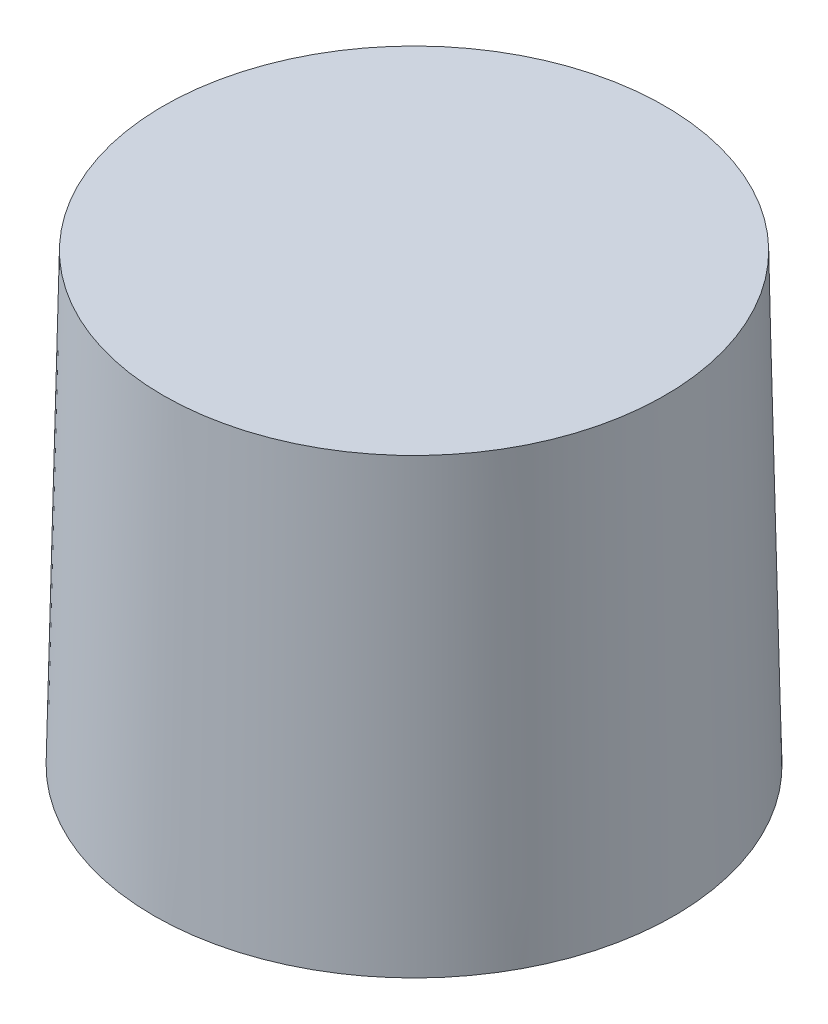
ISO-10303-21;
HEADER;
FILE_DESCRIPTION(('STEP AP214'),'2;1');
FILE_NAME('part.step','',(''),(''),'','','');
FILE_SCHEMA(('AUTOMOTIVE_DESIGN { 1 0 10303 214 1 1 1 1 }'));
ENDSEC;
DATA;
#1=APPLICATION_CONTEXT('core data for automotive mechanical design processes');
#2=APPLICATION_PROTOCOL_DEFINITION('international standard','automotive_design',2000,#1);
#3=PRODUCT_CONTEXT('',#1,'mechanical');
#4=PRODUCT('Part','Part','',(#3));
#5=PRODUCT_RELATED_PRODUCT_CATEGORY('part','',(#4));
#6=PRODUCT_DEFINITION_FORMATION('','',#4);
#7=PRODUCT_DEFINITION_CONTEXT('part definition',#1,'design');
#8=PRODUCT_DEFINITION('design','',#6,#7);
#9=PRODUCT_DEFINITION_SHAPE('','',#8);
#10=(LENGTH_UNIT() NAMED_UNIT(*) SI_UNIT(.MILLI.,.METRE.));
#11=(NAMED_UNIT(*) PLANE_ANGLE_UNIT() SI_UNIT($,.RADIAN.));
#12=(NAMED_UNIT(*) SI_UNIT($,.STERADIAN.) SOLID_ANGLE_UNIT());
#13=UNCERTAINTY_MEASURE_WITH_UNIT(LENGTH_MEASURE(1.E-05),#10,'distance_accuracy_value','');
#14=(GEOMETRIC_REPRESENTATION_CONTEXT(3) GLOBAL_UNCERTAINTY_ASSIGNED_CONTEXT((#13)) GLOBAL_UNIT_ASSIGNED_CONTEXT((#10,
#11,#12)) REPRESENTATION_CONTEXT('',''));
#15=CARTESIAN_POINT('',(0.,0.,0.));
#16=DIRECTION('',(0.,0.,1.));
#17=DIRECTION('',(1.,0.,0.));
#18=AXIS2_PLACEMENT_3D('',#15,#16,#17);
#19=CARTESIAN_POINT('',(0.,0.,0.));
#20=DIRECTION('',(0.,1.,0.));
#21=DIRECTION('',(0.,0.,1.));
#22=AXIS2_PLACEMENT_3D('',#19,#20,#21);
#23=PLANE('',#22);
#24=CARTESIAN_POINT('',(0.,0.,0.));
#25=DIRECTION('',(0.,1.,0.));
#26=DIRECTION('',(0.,0.,1.));
#27=AXIS2_PLACEMENT_3D('',#24,#25,#26);
#28=CIRCLE('',#27,27.);
#29=CARTESIAN_POINT('',(0.,0.,27.));
#30=VERTEX_POINT('',#29);
#31=EDGE_CURVE('E10',#30,#30,#28,.T.);
#32=ORIENTED_EDGE('',*,*,#31,.T.);
#33=EDGE_LOOP('',(#32));
#34=FACE_BOUND('',#33,.T.);
#35=ADVANCED_FACE('F33',(#34),#23,.T.);
#36=CARTESIAN_POINT('',(0.,0.,0.));
#37=DIRECTION('',(0.,-1.,0.));
#38=DIRECTION('',(0.,0.,-1.));
#39=AXIS2_PLACEMENT_3D('',#36,#37,#38);
#40=CONICAL_SURFACE('',#39,27.,0.0211236181653635);
#41=CARTESIAN_POINT('',(0.,-48.,0.));
#42=DIRECTION('',(0.,1.,0.));
#43=DIRECTION('',(0.,0.,1.));
#44=AXIS2_PLACEMENT_3D('',#41,#42,#43);
#45=CIRCLE('',#44,28.0140845070422);
#46=CARTESIAN_POINT('',(0.,-48.,28.0140845070422));
#47=VERTEX_POINT('',#46);
#48=EDGE_CURVE('E39',#47,#47,#45,.T.);
#49=ORIENTED_EDGE('',*,*,#48,.T.);
#50=EDGE_LOOP('',(#49));
#51=FACE_BOUND('',#50,.T.);
#52=ORIENTED_EDGE('',*,*,#31,.F.);
#53=EDGE_LOOP('',(#52));
#54=FACE_BOUND('',#53,.T.);
#55=ADVANCED_FACE('F65',(#51,#54),#40,.T.);
#56=CARTESIAN_POINT('',(-26.0136382168241,-48.,0.));
#57=DIRECTION('',(0.,-1.,0.));
#58=DIRECTION('',(0.,0.,-1.));
#59=AXIS2_PLACEMENT_3D('',#56,#57,#58);
#60=PLANE('',#59);
#61=CARTESIAN_POINT('',(0.,-48.,0.));
#62=DIRECTION('',(0.,1.,0.));
#63=DIRECTION('',(0.,0.,1.));
#64=AXIS2_PLACEMENT_3D('',#61,#62,#63);
#65=CIRCLE('',#64,26.0136382168241);
#66=CARTESIAN_POINT('',(0.,-48.,26.0136382168241));
#67=VERTEX_POINT('',#66);
#68=EDGE_CURVE('E43',#67,#67,#65,.T.);
#69=ORIENTED_EDGE('',*,*,#68,.T.);
#70=EDGE_LOOP('',(#69));
#71=FACE_BOUND('',#70,.T.);
#72=ORIENTED_EDGE('',*,*,#48,.F.);
#73=EDGE_LOOP('',(#72));
#74=FACE_BOUND('',#73,.T.);
#75=ADVANCED_FACE('F62',(#71,#74),#60,.T.);
#76=CARTESIAN_POINT('',(0.,-48.,0.));
#77=DIRECTION('',(0.,-1.,0.));
#78=DIRECTION('',(0.,0.,-1.));
#79=AXIS2_PLACEMENT_3D('',#76,#77,#78);
#80=CONICAL_SURFACE('',#79,26.0136382168241,0.0211236181653633);
#81=CARTESIAN_POINT('',(0.,-2.00044629021816,0.));
#82=DIRECTION('',(0.,1.,0.));
#83=DIRECTION('',(0.,0.,1.));
#84=AXIS2_PLACEMENT_3D('',#81,#82,#83);
#85=CIRCLE('',#84,25.0418166595752);
#86=CARTESIAN_POINT('',(0.,-2.00044629021816,25.0418166595752));
#87=VERTEX_POINT('',#86);
#88=EDGE_CURVE('E47',#87,#87,#85,.T.);
#89=ORIENTED_EDGE('',*,*,#88,.T.);
#90=EDGE_LOOP('',(#89));
#91=FACE_BOUND('',#90,.T.);
#92=ORIENTED_EDGE('',*,*,#68,.F.);
#93=EDGE_LOOP('',(#92));
#94=FACE_BOUND('',#93,.T.);
#95=ADVANCED_FACE('F53',(#91,#94),#80,.F.);
#96=CARTESIAN_POINT('',(-25.0418166595752,-2.00044629021816,0.));
#97=DIRECTION('',(0.,-1.,0.));
#98=DIRECTION('',(0.,0.,-1.));
#99=AXIS2_PLACEMENT_3D('',#96,#97,#98);
#100=PLANE('',#99);
#101=ORIENTED_EDGE('',*,*,#88,.F.);
#102=EDGE_LOOP('',(#101));
#103=FACE_BOUND('',#102,.T.);
#104=ADVANCED_FACE('F56',(#103),#100,.T.);
#105=CLOSED_SHELL('',(#35,#55,#75,#95,#104));
#106=MANIFOLD_SOLID_BREP('B2',#105);
#107=ADVANCED_BREP_SHAPE_REPRESENTATION('',(#18,#106),#14);
#108=SHAPE_DEFINITION_REPRESENTATION(#9,#107);
ENDSEC;
END-ISO-10303-21;
